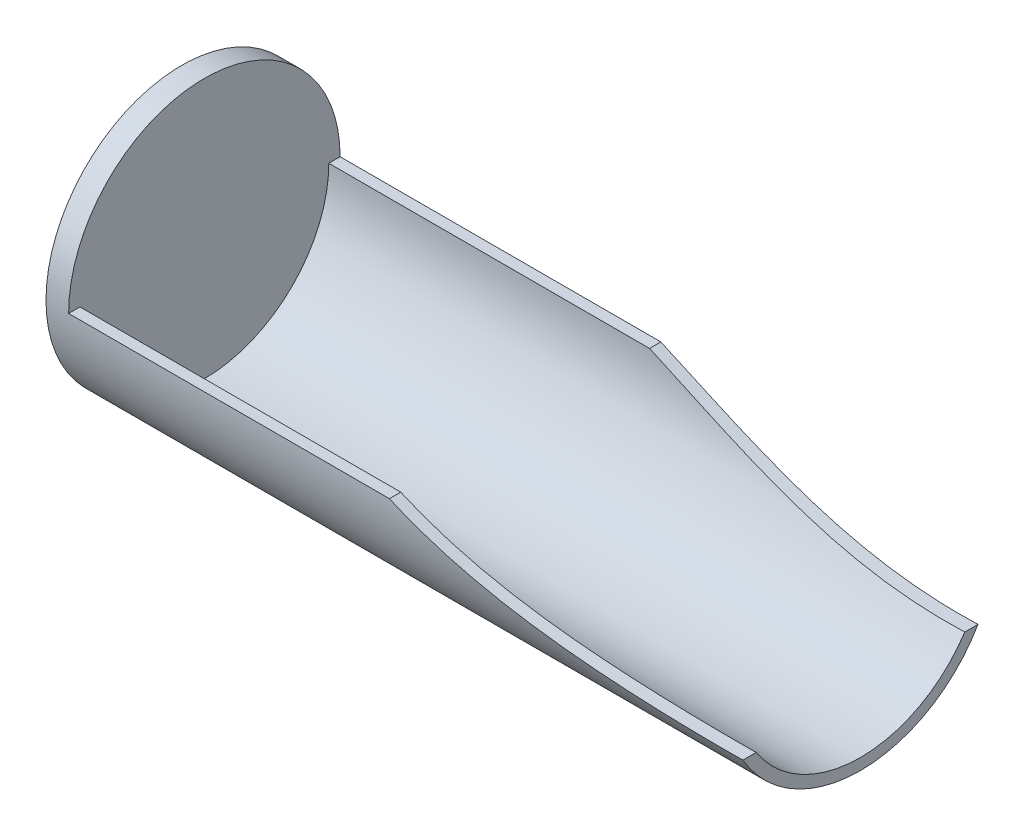
ISO-10303-21;
HEADER;
FILE_DESCRIPTION(('STEP AP214'),'2;1');
FILE_NAME('part.step','',(''),(''),'','','');
FILE_SCHEMA(('AUTOMOTIVE_DESIGN { 1 0 10303 214 1 1 1 1 }'));
ENDSEC;
DATA;
#1=APPLICATION_CONTEXT('core data for automotive mechanical design processes');
#2=APPLICATION_PROTOCOL_DEFINITION('international standard','automotive_design',2000,#1);
#3=PRODUCT_CONTEXT('',#1,'mechanical');
#4=PRODUCT('Part','Part','',(#3));
#5=PRODUCT_RELATED_PRODUCT_CATEGORY('part','',(#4));
#6=PRODUCT_DEFINITION_FORMATION('','',#4);
#7=PRODUCT_DEFINITION_CONTEXT('part definition',#1,'design');
#8=PRODUCT_DEFINITION('design','',#6,#7);
#9=PRODUCT_DEFINITION_SHAPE('','',#8);
#10=(LENGTH_UNIT() NAMED_UNIT(*) SI_UNIT(.MILLI.,.METRE.));
#11=(NAMED_UNIT(*) PLANE_ANGLE_UNIT() SI_UNIT($,.RADIAN.));
#12=(NAMED_UNIT(*) SI_UNIT($,.STERADIAN.) SOLID_ANGLE_UNIT());
#13=UNCERTAINTY_MEASURE_WITH_UNIT(LENGTH_MEASURE(1.E-05),#10,'distance_accuracy_value','');
#14=(GEOMETRIC_REPRESENTATION_CONTEXT(3) GLOBAL_UNCERTAINTY_ASSIGNED_CONTEXT((#13)) GLOBAL_UNIT_ASSIGNED_CONTEXT((#10,
#11,#12)) REPRESENTATION_CONTEXT('',''));
#15=CARTESIAN_POINT('',(0.,0.,0.));
#16=DIRECTION('',(0.,0.,1.));
#17=DIRECTION('',(1.,0.,0.));
#18=AXIS2_PLACEMENT_3D('',#15,#16,#17);
#19=CARTESIAN_POINT('',(600.,0.,0.));
#20=DIRECTION('',(-1.,0.,0.));
#21=DIRECTION('',(0.,0.,1.));
#22=AXIS2_PLACEMENT_3D('',#19,#20,#21);
#23=CYLINDRICAL_SURFACE('',#22,120.);
#24=CARTESIAN_POINT('',(600.,0.,0.));
#25=DIRECTION('',(1.,0.,0.));
#26=DIRECTION('',(0.,0.,-1.));
#27=AXIS2_PLACEMENT_3D('',#24,#25,#26);
#28=CIRCLE('',#27,120.);
#29=CARTESIAN_POINT('',(600.,-60.,103.923048454133));
#30=VERTEX_POINT('',#29);
#31=CARTESIAN_POINT('',(600.,-60.,-103.923048454133));
#32=VERTEX_POINT('',#31);
#33=EDGE_CURVE('E11',#30,#32,#28,.T.);
#34=ORIENTED_EDGE('',*,*,#33,.F.);
#35=CARTESIAN_POINT('',(600.,-60.,103.923048454133));
#36=CARTESIAN_POINT('',(598.279054169271,-60.0372234166385,103.901555231067));
#37=CARTESIAN_POINT('',(596.557938008048,-60.0682644529203,103.88360959979));
#38=CARTESIAN_POINT('',(593.11546532332,-60.1179249611348,103.854879549741));
#39=CARTESIAN_POINT('',(591.394108799605,-60.1365444221227,103.84409513728));
#40=CARTESIAN_POINT('',(586.230020702061,-60.1736838093986,103.822583598256));
#41=CARTESIAN_POINT('',(582.787083612133,-60.1734887963124,103.822695820674));
#42=CARTESIAN_POINT('',(575.901847458892,-60.1227812572336,103.852067718878));
#43=CARTESIAN_POINT('',(572.459548376651,-60.072270597269,103.881326313729));
#44=CARTESIAN_POINT('',(565.57651000633,-59.9205811336991,103.968897485691));
#45=CARTESIAN_POINT('',(562.135770684182,-59.8194034959997,104.027209394251));
#46=CARTESIAN_POINT('',(555.25679817076,-59.5660798128911,104.172469700369));
#47=CARTESIAN_POINT('',(551.818564962733,-59.4139341113921,104.259417904702));
#48=CARTESIAN_POINT('',(544.950547967387,-59.0586848322227,104.461061590654));
#49=CARTESIAN_POINT('',(541.5207591562,-58.8556554264339,104.575716676028));
#50=CARTESIAN_POINT('',(534.665589534135,-58.3983363302042,104.831784185651));
#51=CARTESIAN_POINT('',(531.240208740073,-58.1440464447693,104.973196711685));
#52=CARTESIAN_POINT('',(524.394779175923,-57.5840649945621,105.281420889654));
#53=CARTESIAN_POINT('',(520.974730435348,-57.2783731462852,105.448232681677));
#54=CARTESIAN_POINT('',(514.140870749814,-56.6154976749585,105.805610335092));
#55=CARTESIAN_POINT('',(510.727059809553,-56.2583140131431,105.996176214367));
#56=CARTESIAN_POINT('',(503.906562102782,-55.4924152316964,106.399149801172));
#57=CARTESIAN_POINT('',(500.499875245551,-55.0837007723816,106.611557228819));
#58=CARTESIAN_POINT('',(493.796842221212,-54.22781937729,107.049369900611));
#59=CARTESIAN_POINT('',(490.500262508736,-53.7821809701614,107.274191136115));
#60=CARTESIAN_POINT('',(483.915205550099,-52.8424626099633,107.740192990649));
#61=CARTESIAN_POINT('',(480.626728233355,-52.3483830804294,107.981373466639));
#62=CARTESIAN_POINT('',(474.05847311232,-51.3118449106255,108.477761551596));
#63=CARTESIAN_POINT('',(470.778695305133,-50.7693862864603,108.732969155893));
#64=CARTESIAN_POINT('',(464.228417023503,-49.6361844120777,109.254923564554));
#65=CARTESIAN_POINT('',(460.957916544596,-49.045441185101,109.521670363364));
#66=CARTESIAN_POINT('',(454.426755116523,-47.8157962939687,110.064077521201));
#67=CARTESIAN_POINT('',(451.166094081776,-47.1768950499475,110.339737802454));
#68=CARTESIAN_POINT('',(444.654291773505,-45.8509149588199,110.897299252817));
#69=CARTESIAN_POINT('',(441.403152996706,-45.1638244815931,111.17920191717));
#70=CARTESIAN_POINT('',(434.911677137638,-43.7417779680637,111.746332405535));
#71=CARTESIAN_POINT('',(431.671339979224,-43.006822269935,112.031560206043));
#72=CARTESIAN_POINT('',(425.201865950376,-41.4892296680447,112.602402513075));
#73=CARTESIAN_POINT('',(421.972729143383,-40.7065924946657,112.888017021779));
#74=CARTESIAN_POINT('',(415.526041271576,-39.0938435479008,113.456610498771));
#75=CARTESIAN_POINT('',(412.308490402434,-38.2637309766682,113.739589422675));
#76=CARTESIAN_POINT('',(405.88534866972,-36.5562600838994,114.299812737778));
#77=CARTESIAN_POINT('',(402.679758149794,-35.6789004158611,114.577056965232));
#78=CARTESIAN_POINT('',(396.210918523548,-33.8574811294373,115.128607020833));
#79=CARTESIAN_POINT('',(392.947945408034,-32.9123811355514,115.402715295601));
#80=CARTESIAN_POINT('',(386.435434042227,-30.9734548346222,115.938158659677));
#81=CARTESIAN_POINT('',(383.185895863781,-29.9796282673637,116.199493680757));
#82=CARTESIAN_POINT('',(376.700809244904,-27.9436312518079,116.705843326954));
#83=CARTESIAN_POINT('',(373.465260449521,-26.9014620380672,116.950858368455));
#84=CARTESIAN_POINT('',(367.008692132886,-24.7691957686263,117.420946936333));
#85=CARTESIAN_POINT('',(363.787671974742,-23.6791008368054,117.646021345068));
#86=CARTESIAN_POINT('',(357.360683709421,-21.4514316120824,118.07252913597));
#87=CARTESIAN_POINT('',(354.154714894099,-20.3138595783271,118.273963641281));
#88=CARTESIAN_POINT('',(347.757121881623,-17.9912758383454,118.649476737421));
#89=CARTESIAN_POINT('',(344.565503062021,-16.8062477682779,118.823545788358));
#90=CARTESIAN_POINT('',(338.198322292117,-14.3896670050761,119.140348324708));
#91=CARTESIAN_POINT('',(335.022760474609,-13.1581139278821,119.283081551378));
#92=CARTESIAN_POINT('',(328.688169659022,-10.6490268209022,119.533207778644));
#93=CARTESIAN_POINT('',(325.52914190967,-9.37148937396782,119.640598146833));
#94=CARTESIAN_POINT('',(319.228070425826,-6.77099838838265,119.815911660403));
#95=CARTESIAN_POINT('',(316.086029726281,-5.44803702559214,119.883827970005));
#96=CARTESIAN_POINT('',(309.819395960621,-2.75732151433492,119.975864538565));
#97=CARTESIAN_POINT('',(306.69480860731,-1.38955360250556,119.9999712095));
#98=CARTESIAN_POINT('',(303.579878797512,0.,120.));
#99=B_SPLINE_CURVE_WITH_KNOTS('',3,(#35,#36,#37,#38,#39,#40,#41,#42,#43,#44,#45,#46,#47,#48,#49,
#50,#51,#52,#53,#54,#55,#56,#57,#58,#59,#60,#61,#62,#63,#64,#65,#66,#67,#68,#69,#70,#71,#72,#73,
#74,#75,#76,#77,#78,#79,#80,#81,#82,#83,#84,#85,#86,#87,#88,#89,#90,#91,#92,#93,#94,#95,#96,#97,
#98),.UNSPECIFIED.,.F.,.F.,(4,2,2,2,2,2,2,2,2,2,2,2,2,2,2,2,2,2,2,2,2,2,2,2,2,2,2,2,2,2,2,4),
(0.,5.16441703755876,10.3288386254625,20.6571207269384,30.9850198034853,41.3126812340109,
51.6402729793938,61.9528971361043,72.2655605225838,82.578280789805,92.8910088209783,
103.203604718106,113.205659065167,123.207625968987,133.209589543272,143.211548303365,
153.213419815694,163.217713568939,173.221936648266,183.226216302248,193.230664132328,
203.235397231684,213.459388726054,223.68343482568,233.907219971012,244.130552494198,
254.353399104524,264.579801643726,274.806288619424,285.033537111807,295.26255614418,
305.494747274087),.UNSPECIFIED.);
#100=CARTESIAN_POINT('',(303.579878797512,0.,120.));
#101=VERTEX_POINT('',#100);
#102=EDGE_CURVE('E93',#30,#101,#99,.T.);
#103=ORIENTED_EDGE('',*,*,#102,.T.);
#104=DIRECTION('',(1.,0.,0.));
#105=VECTOR('',#104,1.);
#106=CARTESIAN_POINT('',(20.,0.,120.));
#107=LINE('',#106,#105);
#108=CARTESIAN_POINT('',(20.,0.,120.));
#109=VERTEX_POINT('',#108);
#110=EDGE_CURVE('E107',#109,#101,#107,.T.);
#111=ORIENTED_EDGE('',*,*,#110,.F.);
#112=CARTESIAN_POINT('',(20.,0.,0.));
#113=DIRECTION('',(1.,0.,0.));
#114=DIRECTION('',(0.,0.,-1.));
#115=AXIS2_PLACEMENT_3D('',#112,#113,#114);
#116=CIRCLE('',#115,120.);
#117=CARTESIAN_POINT('',(20.,0.,-120.));
#118=VERTEX_POINT('',#117);
#119=EDGE_CURVE('E132',#118,#109,#116,.T.);
#120=ORIENTED_EDGE('',*,*,#119,.F.);
#121=DIRECTION('',(1.,0.,0.));
#122=VECTOR('',#121,1.);
#123=CARTESIAN_POINT('',(20.,0.,-120.));
#124=LINE('',#123,#122);
#125=CARTESIAN_POINT('',(303.579878797512,0.,-120.));
#126=VERTEX_POINT('',#125);
#127=EDGE_CURVE('E117',#118,#126,#124,.T.);
#128=ORIENTED_EDGE('',*,*,#127,.T.);
#129=CARTESIAN_POINT('',(303.579878797512,0.,-120.));
#130=CARTESIAN_POINT('',(306.741725693287,-1.4104835700859,-119.999969487525));
#131=CARTESIAN_POINT('',(309.913522005458,-2.79851903235804,-119.975132017573));
#132=CARTESIAN_POINT('',(316.275078908224,-5.52839187287274,-119.880371471029));
#133=CARTESIAN_POINT('',(319.464833465584,-6.87024380140201,-119.810462733834));
#134=CARTESIAN_POINT('',(325.861818895342,-9.50711276102858,-119.630098141439));
#135=CARTESIAN_POINT('',(329.069046578639,-10.8021380295517,-119.519649456244));
#136=CARTESIAN_POINT('',(335.500505343678,-13.3447753744082,-119.262524445106));
#137=CARTESIAN_POINT('',(338.724735124495,-14.5923910200509,-119.115850852673));
#138=CARTESIAN_POINT('',(345.189700379515,-17.0396502487685,-118.790462567481));
#139=CARTESIAN_POINT('',(348.430435725251,-18.2392942045762,-118.611748123734));
#140=CARTESIAN_POINT('',(354.926651428221,-20.5896309910967,-118.226413008141));
#141=CARTESIAN_POINT('',(358.182126178507,-21.7403409467992,-118.019802206391));
#142=CARTESIAN_POINT('',(364.708532977708,-23.9928035716992,-117.582573614508));
#143=CARTESIAN_POINT('',(367.97946576543,-25.0945538741811,-117.351954665616));
#144=CARTESIAN_POINT('',(374.536243966649,-27.2486322507236,-116.870569584926));
#145=CARTESIAN_POINT('',(377.822090033945,-28.3009581346127,-116.619802561628));
#146=CARTESIAN_POINT('',(384.408132636354,-30.3557554191259,-116.101898091911));
#147=CARTESIAN_POINT('',(387.708329520324,-31.358225600348,-115.83476024544));
#148=CARTESIAN_POINT('',(394.322496557381,-33.3129137370895,-115.287812725695));
#149=CARTESIAN_POINT('',(397.63646660508,-34.265132076358,-115.008003149219));
#150=CARTESIAN_POINT('',(404.146422831648,-36.0823409442248,-114.450565029393));
#151=CARTESIAN_POINT('',(407.34189215088,-36.9492918209622,-114.173287822168));
#152=CARTESIAN_POINT('',(413.744634372314,-38.6362582074475,-113.61350860577));
#153=CARTESIAN_POINT('',(416.951906907994,-39.4562751617442,-113.331006757758));
#154=CARTESIAN_POINT('',(423.377885476946,-41.0491527627841,-112.763831915505));
#155=CARTESIAN_POINT('',(426.596591297409,-41.822014282415,-112.479158961563));
#156=CARTESIAN_POINT('',(433.045056173711,-43.3203821375735,-111.910618728646));
#157=CARTESIAN_POINT('',(436.274815158116,-44.0458887785376,-111.626751444485));
#158=CARTESIAN_POINT('',(442.744992875247,-45.4493699335793,-111.062715455167));
#159=CARTESIAN_POINT('',(445.985411687242,-46.127344093348,-110.782546777592));
#160=CARTESIAN_POINT('',(452.475565327902,-47.435417274829,-110.22878706117));
#161=CARTESIAN_POINT('',(455.725297476086,-48.0655288676761,-109.955194308148));
#162=CARTESIAN_POINT('',(462.234462853577,-49.2779392510052,-109.417204171304));
#163=CARTESIAN_POINT('',(465.493896176253,-49.8602375797591,-109.152806876296));
#164=CARTESIAN_POINT('',(472.021900280841,-50.9768986278375,-108.635787777902));
#165=CARTESIAN_POINT('',(475.290471068588,-51.5112613165499,-108.383165982035));
#166=CARTESIAN_POINT('',(481.83617071028,-52.5319607060196,-107.892139938826));
#167=CARTESIAN_POINT('',(485.113299562066,-53.0182974189006,-107.653735687895));
#168=CARTESIAN_POINT('',(491.675517146254,-53.9428873409323,-107.193430816049));
#169=CARTESIAN_POINT('',(494.960605937255,-54.3811401949949,-106.971530317015));
#170=CARTESIAN_POINT('',(501.614613438434,-55.2191714354383,-106.541400930825));
#171=CARTESIAN_POINT('',(504.983703358618,-55.6178166477609,-106.333610568884));
#172=CARTESIAN_POINT('',(511.728762208352,-56.3647336272054,-105.939582354563));
#173=CARTESIAN_POINT('',(515.104731216027,-56.7130048189785,-105.753344748354));
#174=CARTESIAN_POINT('',(521.862688768234,-57.3592153171049,-105.404247095332));
#175=CARTESIAN_POINT('',(525.244677305354,-57.6571546853957,-105.241387019751));
#176=CARTESIAN_POINT('',(532.013796265721,-58.2027923026575,-104.940611933359));
#177=CARTESIAN_POINT('',(535.400926660651,-58.4504908273068,-104.802696785672));
#178=CARTESIAN_POINT('',(542.179434244085,-58.8957872511547,-104.553103279988));
#179=CARTESIAN_POINT('',(545.570811417176,-59.093385331647,-104.441424827051));
#180=CARTESIAN_POINT('',(552.361766124638,-59.4389190003397,-104.245165134713));
#181=CARTESIAN_POINT('',(555.761348441173,-59.5867828588887,-104.160623040939));
#182=CARTESIAN_POINT('',(562.562918870804,-59.8326988262499,-104.019557077277));
#183=CARTESIAN_POINT('',(565.964906999693,-59.9307506049991,-103.963033393043));
#184=CARTESIAN_POINT('',(572.770372862993,-60.0773362461906,-103.878394359743));
#185=CARTESIAN_POINT('',(576.173850628671,-60.1258690139621,-103.850279638687));
#186=CARTESIAN_POINT('',(582.981403514178,-60.1737584063915,-103.822539099174));
#187=CARTESIAN_POINT('',(586.385478650879,-60.1731132914694,-103.822914288497));
#188=CARTESIAN_POINT('',(591.49127022293,-60.1355575517171,-103.844666683137));
#189=CARTESIAN_POINT('',(593.193191242572,-60.1169400057664,-103.855449636113));
#190=CARTESIAN_POINT('',(596.596797036369,-60.0675628223148,-103.884015271179));
#191=CARTESIAN_POINT('',(598.298481810725,-60.0368031952016,-103.901797947282));
#192=CARTESIAN_POINT('',(600.,-60.,-103.923048454133));
#193=B_SPLINE_CURVE_WITH_KNOTS('',3,(#129,#130,#131,#132,#133,#134,#135,#136,#137,#138,#139,
#140,#141,#142,#143,#144,#145,#146,#147,#148,#149,#150,#151,#152,#153,#154,#155,#156,#157,#158,
#159,#160,#161,#162,#163,#164,#165,#166,#167,#168,#169,#170,#171,#172,#173,#174,#175,#176,#177,
#178,#179,#180,#181,#182,#183,#184,#185,#186,#187,#188,#189,#190,#191,#192),.UNSPECIFIED.,.F.,
.F.,(4,2,2,2,2,2,2,2,2,2,2,2,2,2,2,2,2,2,2,2,2,2,2,2,2,2,2,2,2,2,2,4),(0.,10.386300324625,
20.76929788375,31.1504599618567,41.5308389228531,51.9111372141984,62.2877723976929,
72.6649086445729,83.0425043061965,93.4203536648512,103.798123761395,113.765496148159,
123.732561590466,133.69944247778,143.666259072844,153.633149953035,163.597413905366,
173.561774070326,183.526140598561,193.490504611405,203.454942203838,213.651347441554,
223.84786912872,234.04437826811,244.240831456349,254.437247747129,264.648307481431,
274.859434874972,285.070787991525,295.282502316682,300.388623636304,305.494740587602),.UNSPECIFIED.);
#194=EDGE_CURVE('E63',#126,#32,#193,.T.);
#195=ORIENTED_EDGE('',*,*,#194,.T.);
#196=EDGE_LOOP('',(#34,#103,#111,#120,#128,#195));
#197=FACE_BOUND('',#196,.T.);
#198=CARTESIAN_POINT('',(0.,0.,0.));
#199=DIRECTION('',(1.,0.,0.));
#200=DIRECTION('',(0.,0.,-1.));
#201=AXIS2_PLACEMENT_3D('',#198,#199,#200);
#202=CIRCLE('',#201,120.);
#203=CARTESIAN_POINT('',(0.,0.,-120.));
#204=VERTEX_POINT('',#203);
#205=EDGE_CURVE('E43',#204,#204,#202,.T.);
#206=ORIENTED_EDGE('',*,*,#205,.T.);
#207=EDGE_LOOP('',(#206));
#208=FACE_BOUND('',#207,.T.);
#209=ADVANCED_FACE('F39',(#197,#208),#23,.T.);
#210=CARTESIAN_POINT('',(600.,0.,0.));
#211=DIRECTION('',(1.,0.,0.));
#212=DIRECTION('',(0.,0.,-1.));
#213=AXIS2_PLACEMENT_3D('',#210,#211,#212);
#214=PLANE('',#213);
#215=DIRECTION('',(0.,0.,1.));
#216=VECTOR('',#215,1.);
#217=CARTESIAN_POINT('',(600.,-60.,-120.));
#218=LINE('',#217,#216);
#219=CARTESIAN_POINT('',(600.,-60.,92.1954445729289));
#220=VERTEX_POINT('',#219);
#221=EDGE_CURVE('E180',#220,#30,#218,.T.);
#222=ORIENTED_EDGE('',*,*,#221,.T.);
#223=ORIENTED_EDGE('',*,*,#33,.T.);
#224=CARTESIAN_POINT('',(600.,-60.,-92.1954445729289));
#225=VERTEX_POINT('',#224);
#226=EDGE_CURVE('E100',#32,#225,#218,.T.);
#227=ORIENTED_EDGE('',*,*,#226,.T.);
#228=CARTESIAN_POINT('',(600.,0.,0.));
#229=DIRECTION('',(1.,0.,0.));
#230=DIRECTION('',(0.,0.,-1.));
#231=AXIS2_PLACEMENT_3D('',#228,#229,#230);
#232=CIRCLE('',#231,110.);
#233=EDGE_CURVE('E109',#220,#225,#232,.T.);
#234=ORIENTED_EDGE('',*,*,#233,.F.);
#235=EDGE_LOOP('',(#222,#223,#227,#234));
#236=FACE_BOUND('',#235,.T.);
#237=ADVANCED_FACE('F200',(#236),#214,.T.);
#238=CARTESIAN_POINT('',(0.,0.,0.));
#239=DIRECTION('',(1.,0.,0.));
#240=DIRECTION('',(0.,0.,-1.));
#241=AXIS2_PLACEMENT_3D('',#238,#239,#240);
#242=PLANE('',#241);
#243=ORIENTED_EDGE('',*,*,#205,.F.);
#244=EDGE_LOOP('',(#243));
#245=FACE_BOUND('',#244,.T.);
#246=ADVANCED_FACE('F198',(#245),#242,.F.);
#247=CARTESIAN_POINT('',(20.,0.,0.));
#248=DIRECTION('',(1.,0.,0.));
#249=DIRECTION('',(0.,0.,-1.));
#250=AXIS2_PLACEMENT_3D('',#247,#248,#249);
#251=CYLINDRICAL_SURFACE('',#250,110.);
#252=ORIENTED_EDGE('',*,*,#233,.T.);
#253=CARTESIAN_POINT('',(600.,-60.,-92.1954445729289));
#254=CARTESIAN_POINT('',(598.328674571697,-60.0361501420846,-92.1719159444171));
#255=CARTESIAN_POINT('',(596.657177459525,-60.0664695103547,-92.152156854856));
#256=CARTESIAN_POINT('',(593.313937792387,-60.1153941839805,-92.1202492154984));
#257=CARTESIAN_POINT('',(591.642195237204,-60.1339994788353,-92.1081006725245));
#258=CARTESIAN_POINT('',(586.627017580958,-60.1721633684065,-92.0831794354328));
#259=CARTESIAN_POINT('',(583.283365744508,-60.1740757536507,-92.0819273556907));
#260=CARTESIAN_POINT('',(576.596701296247,-60.1304646952178,-92.1104111043906));
#261=CARTESIAN_POINT('',(573.253688659495,-60.0849438428993,-92.1401452400028));
#262=CARTESIAN_POINT('',(566.569177251203,-59.9461471382834,-92.2305064317478));
#263=CARTESIAN_POINT('',(563.227678433488,-59.8528728567198,-92.2911324717654));
#264=CARTESIAN_POINT('',(556.547092976279,-59.6182966400574,-92.442837493351));
#265=CARTESIAN_POINT('',(553.208006313582,-59.4769951732788,-92.5339161779707));
#266=CARTESIAN_POINT('',(546.538628735587,-59.1464121343445,-92.745567950444));
#267=CARTESIAN_POINT('',(543.208332368202,-58.9572094518538,-92.86609253183));
#268=CARTESIAN_POINT('',(536.551959980514,-58.5305374381394,-93.1355992097038));
#269=CARTESIAN_POINT('',(533.225883996122,-58.2930676989408,-93.2845815467287));
#270=CARTESIAN_POINT('',(526.578827401605,-57.7697355456657,-93.609574870756));
#271=CARTESIAN_POINT('',(523.25784685204,-57.483872560874,-93.7855861765164));
#272=CARTESIAN_POINT('',(516.621836105524,-56.8636746742864,-94.1629132622992));
#273=CARTESIAN_POINT('',(513.306805948572,-56.5293394479021,-94.3642292117698));
#274=CARTESIAN_POINT('',(506.683533025173,-55.8121640995605,-94.7901695758239));
#275=CARTESIAN_POINT('',(503.37529019556,-55.4293244311164,-95.0147937724734));
#276=CARTESIAN_POINT('',(496.720525604282,-54.6094998478787,-95.4883746873629));
#277=CARTESIAN_POINT('',(493.374108116927,-54.1718385875507,-95.7376252694509));
#278=CARTESIAN_POINT('',(486.689673906884,-53.246692492488,-96.2552370473737));
#279=CARTESIAN_POINT('',(483.351657135433,-52.7592079476483,-96.5235981320119));
#280=CARTESIAN_POINT('',(476.684621003817,-51.7344768031633,-97.0766855640556));
#281=CARTESIAN_POINT('',(473.355601677965,-51.1972300140177,-97.3614119737804));
#282=CARTESIAN_POINT('',(466.70713786905,-50.0730681830675,-97.9443142686249));
#283=CARTESIAN_POINT('',(463.387693404388,-49.4861530458781,-98.2424901795729));
#284=CARTESIAN_POINT('',(456.758938813212,-48.2627799552367,-98.8492298320606));
#285=CARTESIAN_POINT('',(453.449628579379,-47.6263225283213,-99.1577934631796));
#286=CARTESIAN_POINT('',(446.840491913449,-46.3037825381311,-99.7822360991273));
#287=CARTESIAN_POINT('',(443.540668960017,-45.6176837158483,-100.098117477492));
#288=CARTESIAN_POINT('',(436.952071779514,-44.1962159169338,-100.733810842566));
#289=CARTESIAN_POINT('',(433.663297432461,-43.4608474771748,-101.053622786413));
#290=CARTESIAN_POINT('',(427.097149741473,-41.9410128844243,-101.693811837993));
#291=CARTESIAN_POINT('',(423.819776460565,-41.1565464604602,-102.014188948835));
#292=CARTESIAN_POINT('',(417.27677054672,-39.5387081506929,-102.652065922947));
#293=CARTESIAN_POINT('',(414.011138152206,-38.7053352776277,-102.969565727983));
#294=CARTESIAN_POINT('',(407.491943157306,-36.9898962123847,-103.598176017126));
#295=CARTESIAN_POINT('',(404.238380994518,-36.1078282728582,-103.909286271403));
#296=CARTESIAN_POINT('',(397.670674822974,-34.2748653965823,-104.528418802267));
#297=CARTESIAN_POINT('',(394.356817027801,-33.3228676574445,-104.836213664137));
#298=CARTESIAN_POINT('',(387.742637078426,-31.368551408326,-105.437465856761));
#299=CARTESIAN_POINT('',(384.442315019884,-30.3662325433678,-105.730923086345));
#300=CARTESIAN_POINT('',(377.855777923129,-28.3116541125607,-106.299512506272));
#301=CARTESIAN_POINT('',(374.569562434317,-27.259396155031,-106.574645286079));
#302=CARTESIAN_POINT('',(368.011793595691,-25.1053547248985,-107.102524447343));
#303=CARTESIAN_POINT('',(364.740239436083,-24.0035740256216,-107.355272080043));
#304=CARTESIAN_POINT('',(358.212330214558,-21.7509360609722,-107.834236973578));
#305=CARTESIAN_POINT('',(354.95597425195,-20.6000817458976,-108.060455826262));
#306=CARTESIAN_POINT('',(348.457557092076,-18.2492636994901,-108.482215161922));
#307=CARTESIAN_POINT('',(345.215502100903,-17.0492806021775,-108.677743397325));
#308=CARTESIAN_POINT('',(338.747619211618,-14.6011892521551,-109.03364297923));
#309=CARTESIAN_POINT('',(335.521791483873,-13.3530804953731,-109.194013957374));
#310=CARTESIAN_POINT('',(329.08684887119,-10.8092856224886,-109.475096946699));
#311=CARTESIAN_POINT('',(325.877735576594,-9.51359507020814,-109.595805249533));
#312=CARTESIAN_POINT('',(319.476678132744,-6.87520452334677,-109.79290742325));
#313=CARTESIAN_POINT('',(316.284737863094,-5.53249438175889,-109.869291665559));
#314=CARTESIAN_POINT('',(309.918501536799,-2.80069812782803,-109.972828732775));
#315=CARTESIAN_POINT('',(306.74421282956,-1.41159417210949,-109.999962388249));
#316=CARTESIAN_POINT('',(303.579878797512,0.,-110.));
#317=B_SPLINE_CURVE_WITH_KNOTS('',3,(#253,#254,#255,#256,#257,#258,#259,#260,#261,#262,#263,
#264,#265,#266,#267,#268,#269,#270,#271,#272,#273,#274,#275,#276,#277,#278,#279,#280,#281,#282,
#283,#284,#285,#286,#287,#288,#289,#290,#291,#292,#293,#294,#295,#296,#297,#298,#299,#300,#301,
#302,#303,#304,#305,#306,#307,#308,#309,#310,#311,#312,#313,#314,#315,#316),.UNSPECIFIED.,.F.,
.F.,(4,2,2,2,2,2,2,2,2,2,2,2,2,2,2,2,2,2,2,2,2,2,2,2,2,2,2,2,2,2,2,4),(0.,5.01561591095552,
10.0312363181021,20.0616767318613,30.0915691943166,40.1211317688477,50.1505965464202,
60.1636498029085,70.1767876977512,80.1900436885648,90.2033667349857,100.2165961644,
110.368479186453,120.520303143481,130.672165761374,140.824047875684,150.975822110287,
161.130936532156,171.285940315502,181.441000149405,191.596265051439,201.75189459696,
212.136284602471,222.520747872296,232.90487693074,243.288425189744,253.671350069233,
264.058407941418,274.445574638068,284.833712228981,295.224105604808,305.618542288418),.UNSPECIFIED.);
#318=CARTESIAN_POINT('',(303.579878797512,0.,-110.));
#319=VERTEX_POINT('',#318);
#320=EDGE_CURVE('E188',#225,#319,#317,.T.);
#321=ORIENTED_EDGE('',*,*,#320,.T.);
#322=DIRECTION('',(1.,0.,0.));
#323=VECTOR('',#322,1.);
#324=CARTESIAN_POINT('',(20.,0.,-110.));
#325=LINE('',#324,#323);
#326=CARTESIAN_POINT('',(20.,0.,-110.));
#327=VERTEX_POINT('',#326);
#328=EDGE_CURVE('E123',#327,#319,#325,.T.);
#329=ORIENTED_EDGE('',*,*,#328,.F.);
#330=CARTESIAN_POINT('',(20.,0.,0.));
#331=DIRECTION('',(1.,0.,0.));
#332=DIRECTION('',(0.,0.,-1.));
#333=AXIS2_PLACEMENT_3D('',#330,#331,#332);
#334=CIRCLE('',#333,110.);
#335=CARTESIAN_POINT('',(20.,0.,110.));
#336=VERTEX_POINT('',#335);
#337=EDGE_CURVE('E142',#336,#327,#334,.T.);
#338=ORIENTED_EDGE('',*,*,#337,.F.);
#339=DIRECTION('',(1.,0.,0.));
#340=VECTOR('',#339,1.);
#341=CARTESIAN_POINT('',(20.,0.,110.));
#342=LINE('',#341,#340);
#343=CARTESIAN_POINT('',(303.579878797512,0.,110.));
#344=VERTEX_POINT('',#343);
#345=EDGE_CURVE('E116',#336,#344,#342,.T.);
#346=ORIENTED_EDGE('',*,*,#345,.T.);
#347=CARTESIAN_POINT('',(303.579878797512,0.,110.));
#348=CARTESIAN_POINT('',(306.63552904706,-1.36310965575916,109.999967147229));
#349=CARTESIAN_POINT('',(309.70046517414,-2.70525044683119,109.974663111772));
#350=CARTESIAN_POINT('',(315.846873604736,-5.3462980975655,109.877952439924));
#351=CARTESIAN_POINT('',(318.928339483535,-6.64522051532901,109.8065625869));
#352=CARTESIAN_POINT('',(325.107365009389,-9.19926722404028,109.622132456744));
#353=CARTESIAN_POINT('',(328.204921232846,-10.4544004262476,109.509100708648));
#354=CARTESIAN_POINT('',(334.415703474107,-12.9203588580346,109.245603534244));
#355=CARTESIAN_POINT('',(337.528928067597,-14.1311880351206,109.095141452355));
#356=CARTESIAN_POINT('',(343.770598772184,-16.5080434758601,108.760860283695));
#357=CARTESIAN_POINT('',(346.89904471334,-17.6740702384298,108.577041568512));
#358=CARTESIAN_POINT('',(353.169246050333,-19.9603239748623,108.180086047745));
#359=CARTESIAN_POINT('',(356.310995187693,-21.0805703064642,107.9669618036));
#360=CARTESIAN_POINT('',(362.608770432137,-23.275394560552,107.515168269217));
#361=CARTESIAN_POINT('',(365.764797344699,-24.3499698700549,107.276497520123));
#362=CARTESIAN_POINT('',(372.090637325722,-26.4530373822301,106.777361249409));
#363=CARTESIAN_POINT('',(375.260451136423,-27.4815270692582,106.516894540246));
#364=CARTESIAN_POINT('',(381.613358846801,-29.4920367473204,105.977841926422));
#365=CARTESIAN_POINT('',(384.796453184645,-30.4740551917141,105.699255419435));
#366=CARTESIAN_POINT('',(391.175400360596,-32.3912649494374,105.127572862808));
#367=CARTESIAN_POINT('',(394.37125316089,-33.3264564014417,104.834476856142));
#368=CARTESIAN_POINT('',(400.811483201566,-35.1600204609958,104.23393922869));
#369=CARTESIAN_POINT('',(404.056001022272,-36.0578584156059,103.926373036511));
#370=CARTESIAN_POINT('',(410.55722044446,-37.8050668739057,103.303615786721));
#371=CARTESIAN_POINT('',(413.813921664626,-38.6544388811797,102.988424966086));
#372=CARTESIAN_POINT('',(420.339177466172,-40.3044958100097,102.35393947056));
#373=CARTESIAN_POINT('',(423.607731848635,-41.105181544632,102.034644864312));
#374=CARTESIAN_POINT('',(430.15635164139,-42.6576657196639,101.395405566244));
#375=CARTESIAN_POINT('',(433.436417000353,-43.4094643777748,101.075460877326));
#376=CARTESIAN_POINT('',(440.007704393298,-44.8639944392813,100.438301601751));
#377=CARTESIAN_POINT('',(443.298926522439,-45.5667254230584,100.121087038461));
#378=CARTESIAN_POINT('',(449.89122876856,-46.9227694407104,99.4927735521137));
#379=CARTESIAN_POINT('',(453.192306128793,-47.576095153479,99.181673075267));
#380=CARTESIAN_POINT('',(459.804733352493,-48.8333858792502,98.5687048434621));
#381=CARTESIAN_POINT('',(463.116083299391,-49.4373504902635,98.266837163707));
#382=CARTESIAN_POINT('',(469.74852828168,-50.5957867746086,97.6754284375338));
#383=CARTESIAN_POINT('',(473.069623309188,-51.1502584879715,97.3858873811456));
#384=CARTESIAN_POINT('',(479.721011609055,-52.2096073800786,96.8220890970071));
#385=CARTESIAN_POINT('',(483.051304884077,-52.7144845444568,96.5478318736841));
#386=CARTESIAN_POINT('',(489.720531683012,-53.6745750411875,96.0173986340163));
#387=CARTESIAN_POINT('',(493.059465314365,-54.1297877529099,95.7612228436397));
#388=CARTESIAN_POINT('',(499.255403636388,-54.9274335370747,95.305592131081));
#389=CARTESIAN_POINT('',(502.11133440449,-55.2766182948167,95.1033262827505));
#390=CARTESIAN_POINT('',(507.828568322008,-55.9387703300077,94.7153696695462));
#391=CARTESIAN_POINT('',(510.68987155751,-56.251737021997,94.5296791726216));
#392=CARTESIAN_POINT('',(516.417316240749,-56.8414560037384,94.17625526306));
#393=CARTESIAN_POINT('',(519.283457688372,-57.1182082943549,94.0085218499945));
#394=CARTESIAN_POINT('',(525.020039761578,-57.6355284008876,93.6922504299265));
#395=CARTESIAN_POINT('',(527.890480350507,-57.8760965235499,93.5437122602004));
#396=CARTESIAN_POINT('',(533.635109247631,-58.3211041339666,93.2669152730228));
#397=CARTESIAN_POINT('',(536.509297516835,-58.5255439946077,93.1386562462677));
#398=CARTESIAN_POINT('',(542.2608590565,-58.8983773779404,92.9033354907957));
#399=CARTESIAN_POINT('',(545.138232304447,-59.0667711538132,92.7962736131942));
#400=CARTESIAN_POINT('',(550.900508722705,-59.3678783615229,92.6039254005105));
#401=CARTESIAN_POINT('',(553.785416358662,-59.5005303379537,92.5186765838971));
#402=CARTESIAN_POINT('',(559.557252678962,-59.7299102086871,92.3707553668067));
#403=CARTESIAN_POINT('',(562.444181373264,-59.8266379246868,92.3080830783838));
#404=CARTESIAN_POINT('',(568.219488973624,-59.9843342814314,92.205685890293));
#405=CARTESIAN_POINT('',(571.107867911793,-60.0453020919661,92.1659615233897));
#406=CARTESIAN_POINT('',(576.885503159138,-60.1316703481837,92.1096345144753));
#407=CARTESIAN_POINT('',(579.774759499928,-60.1570693077723,92.0930328385485));
#408=CARTESIAN_POINT('',(585.553573200888,-60.172515526764,92.0829455451558));
#409=CARTESIAN_POINT('',(588.44313056879,-60.1625607275301,92.0894612738083));
#410=CARTESIAN_POINT('',(594.221972606889,-60.1075475708273,92.125361825988));
#411=CARTESIAN_POINT('',(597.111257243736,-60.0624867508218,92.1547482537964));
#412=CARTESIAN_POINT('',(600.,-60.,92.1954445729289));
#413=B_SPLINE_CURVE_WITH_KNOTS('',3,(#347,#348,#349,#350,#351,#352,#353,#354,#355,#356,#357,
#358,#359,#360,#361,#362,#363,#364,#365,#366,#367,#368,#369,#370,#371,#372,#373,#374,#375,#376,
#377,#378,#379,#380,#381,#382,#383,#384,#385,#386,#387,#388,#389,#390,#391,#392,#393,#394,#395,
#396,#397,#398,#399,#400,#401,#402,#403,#404,#405,#406,#407,#408,#409,#410,#411,#412),
.UNSPECIFIED.,.F.,.F.,(4,2,2,2,2,2,2,2,2,2,2,2,2,2,2,2,2,2,2,2,2,2,2,2,2,2,2,2,2,2,2,2,4),(0.,
10.0374447483485,20.0712361569569,30.1029735996368,40.1338150230666,50.1645447113956,
60.1909881818813,70.2180045267027,80.2455675442924,90.2734640615155,100.30133088008,
110.442371610838,120.583097559609,130.72365411059,140.864165501076,151.004763600868,
161.142750420751,171.280819794617,181.418880968467,191.556945078992,201.695135865016,
210.347765516207,219.000535016345,227.65330430999,236.306000246881,244.958606872408,
253.611152721593,262.278482400351,270.9458550971,279.613429009619,288.281365049351,
296.94980582826,305.618854715804),.UNSPECIFIED.);
#414=EDGE_CURVE('E55',#344,#220,#413,.T.);
#415=ORIENTED_EDGE('',*,*,#414,.T.);
#416=EDGE_LOOP('',(#252,#321,#329,#338,#346,#415));
#417=FACE_BOUND('',#416,.T.);
#418=ADVANCED_FACE('F193',(#417),#251,.F.);
#419=CARTESIAN_POINT('',(20.,0.,110.));
#420=DIRECTION('',(0.,-1.,0.));
#421=DIRECTION('',(0.,0.,-1.));
#422=AXIS2_PLACEMENT_3D('',#419,#420,#421);
#423=PLANE('',#422);
#424=ORIENTED_EDGE('',*,*,#110,.T.);
#425=DIRECTION('',(0.,0.,1.));
#426=VECTOR('',#425,1.);
#427=CARTESIAN_POINT('',(303.579878797512,0.,-120.));
#428=LINE('',#427,#426);
#429=EDGE_CURVE('E90',#344,#101,#428,.T.);
#430=ORIENTED_EDGE('',*,*,#429,.F.);
#431=ORIENTED_EDGE('',*,*,#345,.F.);
#432=DIRECTION('',(0.,0.,-1.));
#433=VECTOR('',#432,1.);
#434=CARTESIAN_POINT('',(20.,0.,110.));
#435=LINE('',#434,#433);
#436=EDGE_CURVE('E114',#109,#336,#435,.T.);
#437=ORIENTED_EDGE('',*,*,#436,.F.);
#438=EDGE_LOOP('',(#424,#430,#431,#437));
#439=FACE_BOUND('',#438,.T.);
#440=ADVANCED_FACE('F112',(#439),#423,.F.);
#441=CARTESIAN_POINT('',(20.,0.,-110.));
#442=DIRECTION('',(0.,-1.,0.));
#443=DIRECTION('',(0.,0.,-1.));
#444=AXIS2_PLACEMENT_3D('',#441,#442,#443);
#445=PLANE('',#444);
#446=ORIENTED_EDGE('',*,*,#328,.T.);
#447=EDGE_CURVE('E99',#126,#319,#428,.T.);
#448=ORIENTED_EDGE('',*,*,#447,.F.);
#449=ORIENTED_EDGE('',*,*,#127,.F.);
#450=DIRECTION('',(0.,0.,-1.));
#451=VECTOR('',#450,1.);
#452=CARTESIAN_POINT('',(20.,0.,-110.));
#453=LINE('',#452,#451);
#454=EDGE_CURVE('E137',#327,#118,#453,.T.);
#455=ORIENTED_EDGE('',*,*,#454,.F.);
#456=EDGE_LOOP('',(#446,#448,#449,#455));
#457=FACE_BOUND('',#456,.T.);
#458=ADVANCED_FACE('F199',(#457),#445,.F.);
#459=CARTESIAN_POINT('',(20.,0.,0.));
#460=DIRECTION('',(1.,0.,0.));
#461=DIRECTION('',(0.,0.,-1.));
#462=AXIS2_PLACEMENT_3D('',#459,#460,#461);
#463=PLANE('',#462);
#464=ORIENTED_EDGE('',*,*,#337,.T.);
#465=ORIENTED_EDGE('',*,*,#454,.T.);
#466=ORIENTED_EDGE('',*,*,#119,.T.);
#467=ORIENTED_EDGE('',*,*,#436,.T.);
#468=EDGE_LOOP('',(#464,#465,#466,#467));
#469=FACE_BOUND('',#468,.T.);
#470=ADVANCED_FACE('F167',(#469),#463,.T.);
#471=CARTESIAN_POINT('',(303.579878797512,0.,-120.));
#472=CARTESIAN_POINT('',(445.569408119988,-63.3402523943218,-120.));
#473=CARTESIAN_POINT('',(600.,-60.,-120.));
#474=B_SPLINE_CURVE_WITH_KNOTS('',2,(#471,#472,#473),.UNSPECIFIED.,.F.,.F.,(3,3),(0.,1.),.UNSPECIFIED.);
#475=DIRECTION('',(0.,0.,1.));
#476=VECTOR('',#475,1.);
#477=SURFACE_OF_LINEAR_EXTRUSION('',#474,#476);
#478=ORIENTED_EDGE('',*,*,#447,.T.);
#479=ORIENTED_EDGE('',*,*,#320,.F.);
#480=ORIENTED_EDGE('',*,*,#226,.F.);
#481=ORIENTED_EDGE('',*,*,#194,.F.);
#482=EDGE_LOOP('',(#478,#479,#480,#481));
#483=FACE_BOUND('',#482,.T.);
#484=ADVANCED_FACE('F166',(#483),#477,.F.);
#485=ORIENTED_EDGE('',*,*,#221,.F.);
#486=ORIENTED_EDGE('',*,*,#414,.F.);
#487=ORIENTED_EDGE('',*,*,#429,.T.);
#488=ORIENTED_EDGE('',*,*,#102,.F.);
#489=EDGE_LOOP('',(#485,#486,#487,#488));
#490=FACE_BOUND('',#489,.T.);
#491=ADVANCED_FACE('F92',(#490),#477,.F.);
#492=CLOSED_SHELL('',(#209,#237,#246,#418,#440,#458,#470,#484,#491));
#493=MANIFOLD_SOLID_BREP('B2',#492);
#494=ADVANCED_BREP_SHAPE_REPRESENTATION('',(#18,#493),#14);
#495=SHAPE_DEFINITION_REPRESENTATION(#9,#494);
ENDSEC;
END-ISO-10303-21;
